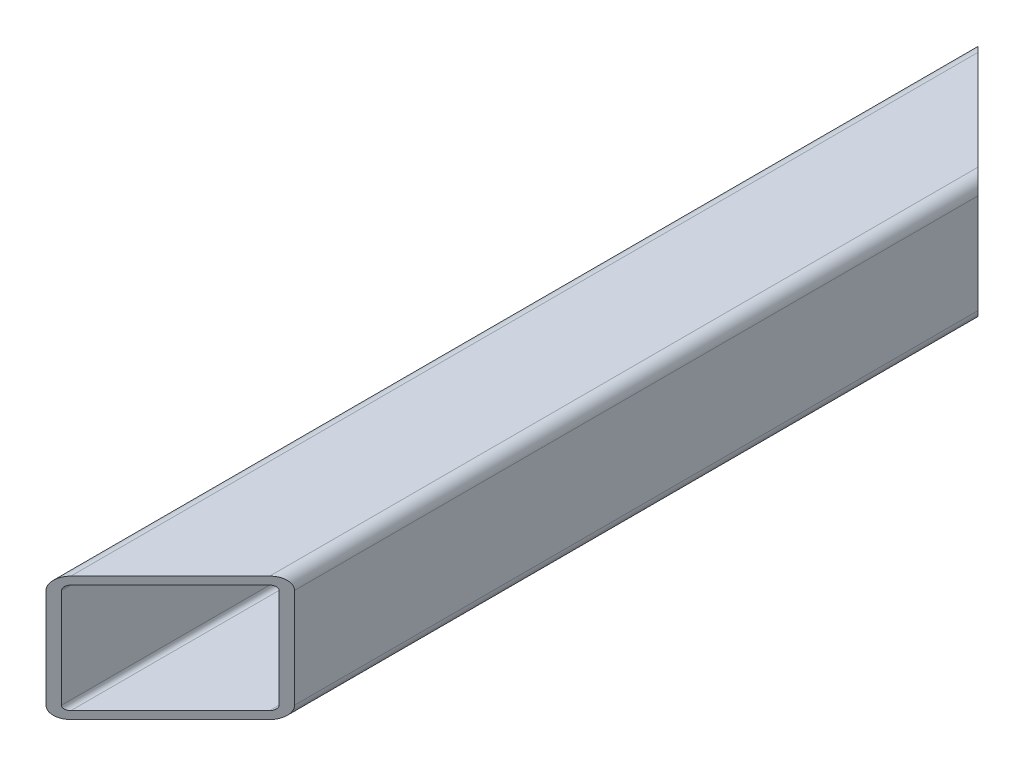
ISO-10303-21;
HEADER;
FILE_DESCRIPTION(('STEP AP214'),'2;1');
FILE_NAME('part.step','',(''),(''),'','','');
FILE_SCHEMA(('AUTOMOTIVE_DESIGN { 1 0 10303 214 1 1 1 1 }'));
ENDSEC;
DATA;
#1=APPLICATION_CONTEXT('core data for automotive mechanical design processes');
#2=APPLICATION_PROTOCOL_DEFINITION('international standard','automotive_design',2000,#1);
#3=PRODUCT_CONTEXT('',#1,'mechanical');
#4=PRODUCT('Part','Part','',(#3));
#5=PRODUCT_RELATED_PRODUCT_CATEGORY('part','',(#4));
#6=PRODUCT_DEFINITION_FORMATION('','',#4);
#7=PRODUCT_DEFINITION_CONTEXT('part definition',#1,'design');
#8=PRODUCT_DEFINITION('design','',#6,#7);
#9=PRODUCT_DEFINITION_SHAPE('','',#8);
#10=(LENGTH_UNIT() NAMED_UNIT(*) SI_UNIT(.MILLI.,.METRE.));
#11=(NAMED_UNIT(*) PLANE_ANGLE_UNIT() SI_UNIT($,.RADIAN.));
#12=(NAMED_UNIT(*) SI_UNIT($,.STERADIAN.) SOLID_ANGLE_UNIT());
#13=UNCERTAINTY_MEASURE_WITH_UNIT(LENGTH_MEASURE(1.E-05),#10,'distance_accuracy_value','');
#14=(GEOMETRIC_REPRESENTATION_CONTEXT(3) GLOBAL_UNCERTAINTY_ASSIGNED_CONTEXT((#13)) GLOBAL_UNIT_ASSIGNED_CONTEXT((#10,
#11,#12)) REPRESENTATION_CONTEXT('',''));
#15=CARTESIAN_POINT('',(0.,0.,0.));
#16=DIRECTION('',(0.,0.,1.));
#17=DIRECTION('',(1.,0.,0.));
#18=AXIS2_PLACEMENT_3D('',#15,#16,#17);
#19=CARTESIAN_POINT('',(72.,8.,-600.));
#20=DIRECTION('',(0.,0.,1.));
#21=DIRECTION('',(1.,0.,0.));
#22=AXIS2_PLACEMENT_3D('',#19,#20,#21);
#23=CYLINDRICAL_SURFACE('',#22,8.);
#24=CARTESIAN_POINT('',(72.,8.,-528.));
#25=DIRECTION('',(-0.707106781186547,0.,0.707106781186548));
#26=DIRECTION('',(0.707106781186548,0.,0.707106781186547));
#27=AXIS2_PLACEMENT_3D('',#24,#25,#26);
#28=ELLIPSE('',#27,11.3137084989848,8.);
#29=CARTESIAN_POINT('',(79.9999999999999,8.,-520.));
#30=VERTEX_POINT('',#29);
#31=CARTESIAN_POINT('',(72.,0.,-528.));
#32=VERTEX_POINT('',#31);
#33=EDGE_CURVE('E246',#30,#32,#28,.F.);
#34=ORIENTED_EDGE('',*,*,#33,.F.);
#35=DIRECTION('',(0.,0.,1.));
#36=VECTOR('',#35,1.);
#37=CARTESIAN_POINT('',(80.,8.,-600.));
#38=LINE('',#37,#36);
#39=CARTESIAN_POINT('',(80.,8.,-80.));
#40=VERTEX_POINT('',#39);
#41=EDGE_CURVE('E156',#30,#40,#38,.T.);
#42=ORIENTED_EDGE('',*,*,#41,.T.);
#43=CARTESIAN_POINT('',(72.,8.,-72.));
#44=DIRECTION('',(-0.707106781186548,0.,-0.707106781186547));
#45=DIRECTION('',(-0.707106781186547,0.,0.707106781186548));
#46=AXIS2_PLACEMENT_3D('',#43,#44,#45);
#47=ELLIPSE('',#46,11.3137084989848,8.);
#48=CARTESIAN_POINT('',(72.,0.,-72.0000000000001));
#49=VERTEX_POINT('',#48);
#50=EDGE_CURVE('E196',#49,#40,#47,.F.);
#51=ORIENTED_EDGE('',*,*,#50,.F.);
#52=DIRECTION('',(0.,0.,1.));
#53=VECTOR('',#52,1.);
#54=CARTESIAN_POINT('',(72.,0.,-600.));
#55=LINE('',#54,#53);
#56=EDGE_CURVE('E182',#32,#49,#55,.T.);
#57=ORIENTED_EDGE('',*,*,#56,.F.);
#58=EDGE_LOOP('',(#34,#42,#51,#57));
#59=FACE_BOUND('',#58,.T.);
#60=ADVANCED_FACE('F33',(#59),#23,.T.);
#61=CARTESIAN_POINT('',(8.,0.,-600.));
#62=DIRECTION('',(0.,-1.,0.));
#63=DIRECTION('',(0.,0.,-1.));
#64=AXIS2_PLACEMENT_3D('',#61,#62,#63);
#65=PLANE('',#64);
#66=DIRECTION('',(0.707106781186548,0.,0.707106781186547));
#67=VECTOR('',#66,1.);
#68=CARTESIAN_POINT('',(79.9999999999999,0.,-520.));
#69=LINE('',#68,#67);
#70=CARTESIAN_POINT('',(8.,0.,-592.));
#71=VERTEX_POINT('',#70);
#72=EDGE_CURVE('E272',#71,#32,#69,.T.);
#73=ORIENTED_EDGE('',*,*,#72,.T.);
#74=ORIENTED_EDGE('',*,*,#56,.T.);
#75=DIRECTION('',(-0.707106781186547,0.,0.707106781186548));
#76=VECTOR('',#75,1.);
#77=CARTESIAN_POINT('',(80.,0.,-80.));
#78=LINE('',#77,#76);
#79=CARTESIAN_POINT('',(7.99999999999998,0.,-8.00000000000001));
#80=VERTEX_POINT('',#79);
#81=EDGE_CURVE('E242',#49,#80,#78,.T.);
#82=ORIENTED_EDGE('',*,*,#81,.T.);
#83=DIRECTION('',(0.,0.,1.));
#84=VECTOR('',#83,1.);
#85=CARTESIAN_POINT('',(8.,0.,-600.));
#86=LINE('',#85,#84);
#87=EDGE_CURVE('E172',#71,#80,#86,.T.);
#88=ORIENTED_EDGE('',*,*,#87,.F.);
#89=EDGE_LOOP('',(#73,#74,#82,#88));
#90=FACE_BOUND('',#89,.T.);
#91=ADVANCED_FACE('F276',(#90),#65,.T.);
#92=CARTESIAN_POINT('',(8.,8.,-600.));
#93=DIRECTION('',(0.,0.,1.));
#94=DIRECTION('',(1.,0.,0.));
#95=AXIS2_PLACEMENT_3D('',#92,#93,#94);
#96=CYLINDRICAL_SURFACE('',#95,8.);
#97=CARTESIAN_POINT('',(8.,8.,-592.));
#98=DIRECTION('',(-0.707106781186547,0.,0.707106781186548));
#99=DIRECTION('',(0.707106781186548,0.,0.707106781186547));
#100=AXIS2_PLACEMENT_3D('',#97,#98,#99);
#101=ELLIPSE('',#100,11.3137084989848,8.);
#102=CARTESIAN_POINT('',(0.,8.,-600.));
#103=VERTEX_POINT('',#102);
#104=EDGE_CURVE('E151',#71,#103,#101,.F.);
#105=ORIENTED_EDGE('',*,*,#104,.F.);
#106=ORIENTED_EDGE('',*,*,#87,.T.);
#107=CARTESIAN_POINT('',(8.,8.,-8.00000000000001));
#108=DIRECTION('',(-0.707106781186548,0.,-0.707106781186547));
#109=DIRECTION('',(-0.707106781186547,0.,0.707106781186548));
#110=AXIS2_PLACEMENT_3D('',#107,#108,#109);
#111=ELLIPSE('',#110,11.3137084989848,8.);
#112=CARTESIAN_POINT('',(0.,8.,0.));
#113=VERTEX_POINT('',#112);
#114=EDGE_CURVE('E211',#113,#80,#111,.F.);
#115=ORIENTED_EDGE('',*,*,#114,.F.);
#116=DIRECTION('',(0.,0.,1.));
#117=VECTOR('',#116,1.);
#118=CARTESIAN_POINT('',(0.,8.,-600.));
#119=LINE('',#118,#117);
#120=EDGE_CURVE('E170',#103,#113,#119,.T.);
#121=ORIENTED_EDGE('',*,*,#120,.F.);
#122=EDGE_LOOP('',(#105,#106,#115,#121));
#123=FACE_BOUND('',#122,.T.);
#124=ADVANCED_FACE('F308',(#123),#96,.T.);
#125=CARTESIAN_POINT('',(0.,8.,-600.));
#126=DIRECTION('',(-1.,0.,0.));
#127=DIRECTION('',(0.,0.,1.));
#128=AXIS2_PLACEMENT_3D('',#125,#126,#127);
#129=PLANE('',#128);
#130=DIRECTION('',(0.,-1.,0.));
#131=VECTOR('',#130,1.);
#132=CARTESIAN_POINT('',(0.,8.,0.));
#133=LINE('',#132,#131);
#134=CARTESIAN_POINT('',(0.,72.,0.));
#135=VERTEX_POINT('',#134);
#136=EDGE_CURVE('E157',#135,#113,#133,.T.);
#137=ORIENTED_EDGE('',*,*,#136,.F.);
#138=DIRECTION('',(0.,0.,1.));
#139=VECTOR('',#138,1.);
#140=CARTESIAN_POINT('',(0.,72.,-600.));
#141=LINE('',#140,#139);
#142=CARTESIAN_POINT('',(0.,72.,-600.));
#143=VERTEX_POINT('',#142);
#144=EDGE_CURVE('E164',#143,#135,#141,.T.);
#145=ORIENTED_EDGE('',*,*,#144,.F.);
#146=DIRECTION('',(0.,-1.,0.));
#147=VECTOR('',#146,1.);
#148=CARTESIAN_POINT('',(0.,8.,-600.));
#149=LINE('',#148,#147);
#150=EDGE_CURVE('E145',#143,#103,#149,.T.);
#151=ORIENTED_EDGE('',*,*,#150,.T.);
#152=ORIENTED_EDGE('',*,*,#120,.T.);
#153=EDGE_LOOP('',(#137,#145,#151,#152));
#154=FACE_BOUND('',#153,.T.);
#155=ADVANCED_FACE('F169',(#154),#129,.T.);
#156=CARTESIAN_POINT('',(7.99999999999999,72.,-600.));
#157=DIRECTION('',(0.,0.,1.));
#158=DIRECTION('',(1.,0.,0.));
#159=AXIS2_PLACEMENT_3D('',#156,#157,#158);
#160=CYLINDRICAL_SURFACE('',#159,8.00000000000001);
#161=CARTESIAN_POINT('',(7.99999999999999,72.,-592.));
#162=DIRECTION('',(-0.707106781186547,0.,0.707106781186548));
#163=DIRECTION('',(0.707106781186548,0.,0.707106781186547));
#164=AXIS2_PLACEMENT_3D('',#161,#162,#163);
#165=ELLIPSE('',#164,11.3137084989848,8.00000000000001);
#166=CARTESIAN_POINT('',(7.99999999999998,80.,-592.));
#167=VERTEX_POINT('',#166);
#168=EDGE_CURVE('E148',#143,#167,#165,.F.);
#169=ORIENTED_EDGE('',*,*,#168,.F.);
#170=ORIENTED_EDGE('',*,*,#144,.T.);
#171=CARTESIAN_POINT('',(7.99999999999999,72.,-8.00000000000001));
#172=DIRECTION('',(-0.707106781186548,0.,-0.707106781186547));
#173=DIRECTION('',(-0.707106781186547,0.,0.707106781186548));
#174=AXIS2_PLACEMENT_3D('',#171,#172,#173);
#175=ELLIPSE('',#174,11.3137084989848,8.00000000000001);
#176=CARTESIAN_POINT('',(7.99999999999995,80.,-7.99999999999997));
#177=VERTEX_POINT('',#176);
#178=EDGE_CURVE('E214',#177,#135,#175,.F.);
#179=ORIENTED_EDGE('',*,*,#178,.F.);
#180=DIRECTION('',(0.,0.,1.));
#181=VECTOR('',#180,1.);
#182=CARTESIAN_POINT('',(7.99999999999999,80.,-600.));
#183=LINE('',#182,#181);
#184=EDGE_CURVE('E166',#167,#177,#183,.T.);
#185=ORIENTED_EDGE('',*,*,#184,.F.);
#186=EDGE_LOOP('',(#169,#170,#179,#185));
#187=FACE_BOUND('',#186,.T.);
#188=ADVANCED_FACE('F162',(#187),#160,.T.);
#189=CARTESIAN_POINT('',(7.99999999999999,80.,-600.));
#190=DIRECTION('',(0.,1.,0.));
#191=DIRECTION('',(-1.,0.,0.));
#192=AXIS2_PLACEMENT_3D('',#189,#190,#191);
#193=PLANE('',#192);
#194=DIRECTION('',(0.707106781186548,0.,0.707106781186547));
#195=VECTOR('',#194,1.);
#196=CARTESIAN_POINT('',(80.,80.,-520.));
#197=LINE('',#196,#195);
#198=CARTESIAN_POINT('',(72.,80.,-528.));
#199=VERTEX_POINT('',#198);
#200=EDGE_CURVE('E273',#167,#199,#197,.T.);
#201=ORIENTED_EDGE('',*,*,#200,.F.);
#202=ORIENTED_EDGE('',*,*,#184,.T.);
#203=DIRECTION('',(-0.707106781186547,0.,0.707106781186548));
#204=VECTOR('',#203,1.);
#205=CARTESIAN_POINT('',(80.,80.,-80.));
#206=LINE('',#205,#204);
#207=CARTESIAN_POINT('',(72.,80.,-72.0000000000001));
#208=VERTEX_POINT('',#207);
#209=EDGE_CURVE('E243',#208,#177,#206,.T.);
#210=ORIENTED_EDGE('',*,*,#209,.F.);
#211=DIRECTION('',(0.,0.,1.));
#212=VECTOR('',#211,1.);
#213=CARTESIAN_POINT('',(72.,80.,-600.));
#214=LINE('',#213,#212);
#215=EDGE_CURVE('E174',#199,#208,#214,.T.);
#216=ORIENTED_EDGE('',*,*,#215,.F.);
#217=EDGE_LOOP('',(#201,#202,#210,#216));
#218=FACE_BOUND('',#217,.T.);
#219=ADVANCED_FACE('F295',(#218),#193,.T.);
#220=CARTESIAN_POINT('',(72.,72.,-600.));
#221=DIRECTION('',(0.,0.,1.));
#222=DIRECTION('',(1.,0.,0.));
#223=AXIS2_PLACEMENT_3D('',#220,#221,#222);
#224=CYLINDRICAL_SURFACE('',#223,7.99999999999999);
#225=CARTESIAN_POINT('',(72.,72.,-528.));
#226=DIRECTION('',(-0.707106781186547,0.,0.707106781186548));
#227=DIRECTION('',(0.707106781186548,0.,0.707106781186547));
#228=AXIS2_PLACEMENT_3D('',#225,#226,#227);
#229=ELLIPSE('',#228,11.3137084989848,7.99999999999999);
#230=CARTESIAN_POINT('',(80.,72.,-520.));
#231=VERTEX_POINT('',#230);
#232=EDGE_CURVE('E167',#199,#231,#229,.F.);
#233=ORIENTED_EDGE('',*,*,#232,.F.);
#234=ORIENTED_EDGE('',*,*,#215,.T.);
#235=CARTESIAN_POINT('',(72.,72.,-72.));
#236=DIRECTION('',(-0.707106781186548,0.,-0.707106781186547));
#237=DIRECTION('',(-0.707106781186547,0.,0.707106781186548));
#238=AXIS2_PLACEMENT_3D('',#235,#236,#237);
#239=ELLIPSE('',#238,11.3137084989848,7.99999999999999);
#240=CARTESIAN_POINT('',(80.,72.,-80.));
#241=VERTEX_POINT('',#240);
#242=EDGE_CURVE('E216',#241,#208,#239,.F.);
#243=ORIENTED_EDGE('',*,*,#242,.F.);
#244=DIRECTION('',(0.,0.,1.));
#245=VECTOR('',#244,1.);
#246=CARTESIAN_POINT('',(80.,72.,-600.));
#247=LINE('',#246,#245);
#248=EDGE_CURVE('E179',#231,#241,#247,.T.);
#249=ORIENTED_EDGE('',*,*,#248,.F.);
#250=EDGE_LOOP('',(#233,#234,#243,#249));
#251=FACE_BOUND('',#250,.T.);
#252=ADVANCED_FACE('F291',(#251),#224,.T.);
#253=CARTESIAN_POINT('',(80.,8.,-600.));
#254=DIRECTION('',(1.,0.,0.));
#255=DIRECTION('',(0.,1.,0.));
#256=AXIS2_PLACEMENT_3D('',#253,#254,#255);
#257=PLANE('',#256);
#258=DIRECTION('',(0.,1.,0.));
#259=VECTOR('',#258,1.);
#260=CARTESIAN_POINT('',(79.9999999999999,0.,-520.));
#261=LINE('',#260,#259);
#262=EDGE_CURVE('E269',#30,#231,#261,.T.);
#263=ORIENTED_EDGE('',*,*,#262,.T.);
#264=ORIENTED_EDGE('',*,*,#248,.T.);
#265=DIRECTION('',(0.,1.,0.));
#266=VECTOR('',#265,1.);
#267=CARTESIAN_POINT('',(80.,0.,-80.));
#268=LINE('',#267,#266);
#269=EDGE_CURVE('E239',#40,#241,#268,.T.);
#270=ORIENTED_EDGE('',*,*,#269,.F.);
#271=ORIENTED_EDGE('',*,*,#41,.F.);
#272=EDGE_LOOP('',(#263,#264,#270,#271));
#273=FACE_BOUND('',#272,.T.);
#274=ADVANCED_FACE('F287',(#273),#257,.T.);
#275=CARTESIAN_POINT('',(7.99999999999999,72.,-600.));
#276=DIRECTION('',(0.,0.,1.));
#277=DIRECTION('',(1.,0.,0.));
#278=AXIS2_PLACEMENT_3D('',#275,#276,#277);
#279=CYLINDRICAL_SURFACE('',#278,3.00000000000001);
#280=DIRECTION('',(0.,0.,1.));
#281=VECTOR('',#280,1.);
#282=CARTESIAN_POINT('',(5.,72.,-600.));
#283=LINE('',#282,#281);
#284=CARTESIAN_POINT('',(5.,72.,-595.));
#285=VERTEX_POINT('',#284);
#286=CARTESIAN_POINT('',(5.,72.,-4.99999999999998));
#287=VERTEX_POINT('',#286);
#288=EDGE_CURVE('E194',#285,#287,#283,.T.);
#289=ORIENTED_EDGE('',*,*,#288,.F.);
#290=CARTESIAN_POINT('',(7.99999999999999,72.,-592.));
#291=DIRECTION('',(-0.707106781186547,0.,0.707106781186548));
#292=DIRECTION('',(0.707106781186548,0.,0.707106781186547));
#293=AXIS2_PLACEMENT_3D('',#290,#291,#292);
#294=ELLIPSE('',#293,4.2426406871193,3.00000000000001);
#295=CARTESIAN_POINT('',(7.99999999999999,75.,-592.));
#296=VERTEX_POINT('',#295);
#297=EDGE_CURVE('E47',#285,#296,#294,.F.);
#298=ORIENTED_EDGE('',*,*,#297,.T.);
#299=DIRECTION('',(0.,0.,1.));
#300=VECTOR('',#299,1.);
#301=CARTESIAN_POINT('',(7.99999999999999,75.,-600.));
#302=LINE('',#301,#300);
#303=CARTESIAN_POINT('',(8.00000000000001,75.,-8.00000000000001));
#304=VERTEX_POINT('',#303);
#305=EDGE_CURVE('E192',#296,#304,#302,.T.);
#306=ORIENTED_EDGE('',*,*,#305,.T.);
#307=CARTESIAN_POINT('',(7.99999999999999,72.,-8.00000000000001));
#308=DIRECTION('',(-0.707106781186548,0.,-0.707106781186547));
#309=DIRECTION('',(-0.707106781186547,0.,0.707106781186548));
#310=AXIS2_PLACEMENT_3D('',#307,#308,#309);
#311=ELLIPSE('',#310,4.2426406871193,3.00000000000001);
#312=EDGE_CURVE('E219',#304,#287,#311,.F.);
#313=ORIENTED_EDGE('',*,*,#312,.T.);
#314=EDGE_LOOP('',(#289,#298,#306,#313));
#315=FACE_BOUND('',#314,.T.);
#316=ADVANCED_FACE('F316',(#315),#279,.F.);
#317=CARTESIAN_POINT('',(7.99999999999999,75.,-600.));
#318=DIRECTION('',(0.,1.,0.));
#319=DIRECTION('',(0.,0.,1.));
#320=AXIS2_PLACEMENT_3D('',#317,#318,#319);
#321=PLANE('',#320);
#322=ORIENTED_EDGE('',*,*,#305,.F.);
#323=DIRECTION('',(0.707106781186548,0.,0.707106781186547));
#324=VECTOR('',#323,1.);
#325=CARTESIAN_POINT('',(4.,75.,-596.));
#326=LINE('',#325,#324);
#327=CARTESIAN_POINT('',(72.,75.,-528.));
#328=VERTEX_POINT('',#327);
#329=EDGE_CURVE('E252',#296,#328,#326,.T.);
#330=ORIENTED_EDGE('',*,*,#329,.T.);
#331=DIRECTION('',(0.,0.,1.));
#332=VECTOR('',#331,1.);
#333=CARTESIAN_POINT('',(72.,75.,-600.));
#334=LINE('',#333,#332);
#335=CARTESIAN_POINT('',(72.,75.,-72.));
#336=VERTEX_POINT('',#335);
#337=EDGE_CURVE('E206',#328,#336,#334,.T.);
#338=ORIENTED_EDGE('',*,*,#337,.T.);
#339=DIRECTION('',(-0.707106781186547,0.,0.707106781186548));
#340=VECTOR('',#339,1.);
#341=CARTESIAN_POINT('',(304.,75.,-304.));
#342=LINE('',#341,#340);
#343=EDGE_CURVE('E222',#336,#304,#342,.T.);
#344=ORIENTED_EDGE('',*,*,#343,.T.);
#345=EDGE_LOOP('',(#322,#330,#338,#344));
#346=FACE_BOUND('',#345,.T.);
#347=ADVANCED_FACE('F354',(#346),#321,.F.);
#348=CARTESIAN_POINT('',(72.,72.,-600.));
#349=DIRECTION('',(0.,0.,1.));
#350=DIRECTION('',(1.,0.,0.));
#351=AXIS2_PLACEMENT_3D('',#348,#349,#350);
#352=CYLINDRICAL_SURFACE('',#351,3.00000000000002);
#353=ORIENTED_EDGE('',*,*,#337,.F.);
#354=CARTESIAN_POINT('',(72.,72.,-528.));
#355=DIRECTION('',(-0.707106781186547,0.,0.707106781186548));
#356=DIRECTION('',(0.707106781186548,0.,0.707106781186547));
#357=AXIS2_PLACEMENT_3D('',#354,#355,#356);
#358=ELLIPSE('',#357,4.24264068711931,3.00000000000002);
#359=CARTESIAN_POINT('',(75.,72.,-525.));
#360=VERTEX_POINT('',#359);
#361=EDGE_CURVE('E255',#328,#360,#358,.F.);
#362=ORIENTED_EDGE('',*,*,#361,.T.);
#363=DIRECTION('',(0.,0.,1.));
#364=VECTOR('',#363,1.);
#365=CARTESIAN_POINT('',(75.,72.,-600.));
#366=LINE('',#365,#364);
#367=CARTESIAN_POINT('',(75.,72.,-75.));
#368=VERTEX_POINT('',#367);
#369=EDGE_CURVE('E204',#360,#368,#366,.T.);
#370=ORIENTED_EDGE('',*,*,#369,.T.);
#371=CARTESIAN_POINT('',(72.,72.,-72.));
#372=DIRECTION('',(-0.707106781186548,0.,-0.707106781186547));
#373=DIRECTION('',(-0.707106781186547,0.,0.707106781186548));
#374=AXIS2_PLACEMENT_3D('',#371,#372,#373);
#375=ELLIPSE('',#374,4.24264068711931,3.00000000000002);
#376=EDGE_CURVE('E225',#368,#336,#375,.F.);
#377=ORIENTED_EDGE('',*,*,#376,.T.);
#378=EDGE_LOOP('',(#353,#362,#370,#377));
#379=FACE_BOUND('',#378,.T.);
#380=ADVANCED_FACE('F363',(#379),#352,.F.);
#381=CARTESIAN_POINT('',(75.,8.,-600.));
#382=DIRECTION('',(1.,0.,0.));
#383=DIRECTION('',(0.,0.,-1.));
#384=AXIS2_PLACEMENT_3D('',#381,#382,#383);
#385=PLANE('',#384);
#386=ORIENTED_EDGE('',*,*,#369,.F.);
#387=DIRECTION('',(0.,-1.,0.));
#388=VECTOR('',#387,1.);
#389=CARTESIAN_POINT('',(75.,8.00000000000004,-525.));
#390=LINE('',#389,#388);
#391=CARTESIAN_POINT('',(75.,8.,-525.));
#392=VERTEX_POINT('',#391);
#393=EDGE_CURVE('E258',#360,#392,#390,.T.);
#394=ORIENTED_EDGE('',*,*,#393,.T.);
#395=DIRECTION('',(0.,0.,1.));
#396=VECTOR('',#395,1.);
#397=CARTESIAN_POINT('',(75.,8.,-600.));
#398=LINE('',#397,#396);
#399=CARTESIAN_POINT('',(75.,8.,-74.9999999999998));
#400=VERTEX_POINT('',#399);
#401=EDGE_CURVE('E202',#392,#400,#398,.T.);
#402=ORIENTED_EDGE('',*,*,#401,.T.);
#403=DIRECTION('',(0.,1.,0.));
#404=VECTOR('',#403,1.);
#405=CARTESIAN_POINT('',(75.,7.99999999999977,-75.0000000000001));
#406=LINE('',#405,#404);
#407=EDGE_CURVE('E228',#400,#368,#406,.T.);
#408=ORIENTED_EDGE('',*,*,#407,.T.);
#409=EDGE_LOOP('',(#386,#394,#402,#408));
#410=FACE_BOUND('',#409,.T.);
#411=ADVANCED_FACE('F373',(#410),#385,.F.);
#412=CARTESIAN_POINT('',(72.,8.,-600.));
#413=DIRECTION('',(0.,0.,1.));
#414=DIRECTION('',(1.,0.,0.));
#415=AXIS2_PLACEMENT_3D('',#412,#413,#414);
#416=CYLINDRICAL_SURFACE('',#415,2.99999999999999);
#417=ORIENTED_EDGE('',*,*,#401,.F.);
#418=CARTESIAN_POINT('',(72.,8.,-528.));
#419=DIRECTION('',(-0.707106781186547,0.,0.707106781186548));
#420=DIRECTION('',(0.707106781186548,0.,0.707106781186547));
#421=AXIS2_PLACEMENT_3D('',#418,#419,#420);
#422=ELLIPSE('',#421,4.24264068711927,2.99999999999999);
#423=CARTESIAN_POINT('',(72.,5.,-528.));
#424=VERTEX_POINT('',#423);
#425=EDGE_CURVE('E261',#392,#424,#422,.F.);
#426=ORIENTED_EDGE('',*,*,#425,.T.);
#427=DIRECTION('',(0.,0.,1.));
#428=VECTOR('',#427,1.);
#429=CARTESIAN_POINT('',(72.,5.00000000000001,-600.));
#430=LINE('',#429,#428);
#431=CARTESIAN_POINT('',(72.,5.,-72.));
#432=VERTEX_POINT('',#431);
#433=EDGE_CURVE('E200',#424,#432,#430,.T.);
#434=ORIENTED_EDGE('',*,*,#433,.T.);
#435=CARTESIAN_POINT('',(72.,8.,-72.));
#436=DIRECTION('',(-0.707106781186548,0.,-0.707106781186547));
#437=DIRECTION('',(-0.707106781186547,0.,0.707106781186548));
#438=AXIS2_PLACEMENT_3D('',#435,#436,#437);
#439=ELLIPSE('',#438,4.24264068711928,2.99999999999999);
#440=EDGE_CURVE('E231',#432,#400,#439,.F.);
#441=ORIENTED_EDGE('',*,*,#440,.T.);
#442=EDGE_LOOP('',(#417,#426,#434,#441));
#443=FACE_BOUND('',#442,.T.);
#444=ADVANCED_FACE('F383',(#443),#416,.F.);
#445=CARTESIAN_POINT('',(8.,5.,-600.));
#446=DIRECTION('',(0.,-1.,0.));
#447=DIRECTION('',(1.,0.,0.));
#448=AXIS2_PLACEMENT_3D('',#445,#446,#447);
#449=PLANE('',#448);
#450=ORIENTED_EDGE('',*,*,#433,.F.);
#451=DIRECTION('',(-0.707106781186548,0.,-0.707106781186547));
#452=VECTOR('',#451,1.);
#453=CARTESIAN_POINT('',(3.99999999999998,5.,-596.));
#454=LINE('',#453,#452);
#455=CARTESIAN_POINT('',(8.,5.,-592.));
#456=VERTEX_POINT('',#455);
#457=EDGE_CURVE('E264',#424,#456,#454,.T.);
#458=ORIENTED_EDGE('',*,*,#457,.T.);
#459=DIRECTION('',(0.,0.,1.));
#460=VECTOR('',#459,1.);
#461=CARTESIAN_POINT('',(8.,5.,-600.));
#462=LINE('',#461,#460);
#463=CARTESIAN_POINT('',(8.,5.,-8.00000000000001));
#464=VERTEX_POINT('',#463);
#465=EDGE_CURVE('E198',#456,#464,#462,.T.);
#466=ORIENTED_EDGE('',*,*,#465,.T.);
#467=DIRECTION('',(0.707106781186547,0.,-0.707106781186548));
#468=VECTOR('',#467,1.);
#469=CARTESIAN_POINT('',(304.,5.00000000000002,-304.));
#470=LINE('',#469,#468);
#471=EDGE_CURVE('E234',#464,#432,#470,.T.);
#472=ORIENTED_EDGE('',*,*,#471,.T.);
#473=EDGE_LOOP('',(#450,#458,#466,#472));
#474=FACE_BOUND('',#473,.T.);
#475=ADVANCED_FACE('F393',(#474),#449,.F.);
#476=CARTESIAN_POINT('',(8.,8.,-600.));
#477=DIRECTION('',(0.,0.,1.));
#478=DIRECTION('',(1.,0.,0.));
#479=AXIS2_PLACEMENT_3D('',#476,#477,#478);
#480=CYLINDRICAL_SURFACE('',#479,3.);
#481=ORIENTED_EDGE('',*,*,#465,.F.);
#482=CARTESIAN_POINT('',(8.,8.,-592.));
#483=DIRECTION('',(-0.707106781186547,0.,0.707106781186548));
#484=DIRECTION('',(0.707106781186548,0.,0.707106781186547));
#485=AXIS2_PLACEMENT_3D('',#482,#483,#484);
#486=ELLIPSE('',#485,4.24264068711928,3.);
#487=CARTESIAN_POINT('',(5.,8.,-595.));
#488=VERTEX_POINT('',#487);
#489=EDGE_CURVE('E267',#456,#488,#486,.F.);
#490=ORIENTED_EDGE('',*,*,#489,.T.);
#491=DIRECTION('',(0.,0.,1.));
#492=VECTOR('',#491,1.);
#493=CARTESIAN_POINT('',(5.,8.,-600.));
#494=LINE('',#493,#492);
#495=CARTESIAN_POINT('',(5.,8.,-5.));
#496=VERTEX_POINT('',#495);
#497=EDGE_CURVE('E54',#488,#496,#494,.T.);
#498=ORIENTED_EDGE('',*,*,#497,.T.);
#499=CARTESIAN_POINT('',(8.,8.,-8.00000000000001));
#500=DIRECTION('',(-0.707106781186548,0.,-0.707106781186547));
#501=DIRECTION('',(-0.707106781186547,0.,0.707106781186548));
#502=AXIS2_PLACEMENT_3D('',#499,#500,#501);
#503=ELLIPSE('',#502,4.24264068711929,3.);
#504=EDGE_CURVE('E237',#496,#464,#503,.F.);
#505=ORIENTED_EDGE('',*,*,#504,.T.);
#506=EDGE_LOOP('',(#481,#490,#498,#505));
#507=FACE_BOUND('',#506,.T.);
#508=ADVANCED_FACE('F403',(#507),#480,.F.);
#509=CARTESIAN_POINT('',(5.,8.,-600.));
#510=DIRECTION('',(-1.,0.,0.));
#511=DIRECTION('',(0.,0.,1.));
#512=AXIS2_PLACEMENT_3D('',#509,#510,#511);
#513=PLANE('',#512);
#514=ORIENTED_EDGE('',*,*,#497,.F.);
#515=DIRECTION('',(0.,1.,0.));
#516=VECTOR('',#515,1.);
#517=CARTESIAN_POINT('',(5.,8.,-595.));
#518=LINE('',#517,#516);
#519=EDGE_CURVE('E11',#488,#285,#518,.T.);
#520=ORIENTED_EDGE('',*,*,#519,.T.);
#521=ORIENTED_EDGE('',*,*,#288,.T.);
#522=DIRECTION('',(0.,-1.,0.));
#523=VECTOR('',#522,1.);
#524=CARTESIAN_POINT('',(5.,7.99999999999974,-5.));
#525=LINE('',#524,#523);
#526=EDGE_CURVE('E40',#287,#496,#525,.T.);
#527=ORIENTED_EDGE('',*,*,#526,.T.);
#528=EDGE_LOOP('',(#514,#520,#521,#527));
#529=FACE_BOUND('',#528,.T.);
#530=ADVANCED_FACE('F413',(#529),#513,.F.);
#531=CARTESIAN_POINT('',(80.,0.,-80.));
#532=DIRECTION('',(-0.707106781186548,0.,-0.707106781186547));
#533=DIRECTION('',(-0.707106781186547,0.,0.707106781186548));
#534=AXIS2_PLACEMENT_3D('',#531,#532,#533);
#535=PLANE('',#534);
#536=ORIENTED_EDGE('',*,*,#50,.T.);
#537=ORIENTED_EDGE('',*,*,#269,.T.);
#538=ORIENTED_EDGE('',*,*,#242,.T.);
#539=ORIENTED_EDGE('',*,*,#209,.T.);
#540=ORIENTED_EDGE('',*,*,#178,.T.);
#541=ORIENTED_EDGE('',*,*,#136,.T.);
#542=ORIENTED_EDGE('',*,*,#114,.T.);
#543=ORIENTED_EDGE('',*,*,#81,.F.);
#544=EDGE_LOOP('',(#536,#537,#538,#539,#540,#541,#542,#543));
#545=FACE_BOUND('',#544,.T.);
#546=ORIENTED_EDGE('',*,*,#343,.F.);
#547=ORIENTED_EDGE('',*,*,#376,.F.);
#548=ORIENTED_EDGE('',*,*,#407,.F.);
#549=ORIENTED_EDGE('',*,*,#440,.F.);
#550=ORIENTED_EDGE('',*,*,#471,.F.);
#551=ORIENTED_EDGE('',*,*,#504,.F.);
#552=ORIENTED_EDGE('',*,*,#526,.F.);
#553=ORIENTED_EDGE('',*,*,#312,.F.);
#554=EDGE_LOOP('',(#546,#547,#548,#549,#550,#551,#552,#553));
#555=FACE_BOUND('',#554,.T.);
#556=ADVANCED_FACE('F283',(#545,#555),#535,.F.);
#557=CARTESIAN_POINT('',(79.9999999999999,0.,-520.));
#558=DIRECTION('',(-0.707106781186547,0.,0.707106781186548));
#559=DIRECTION('',(0.707106781186548,0.,0.707106781186547));
#560=AXIS2_PLACEMENT_3D('',#557,#558,#559);
#561=PLANE('',#560);
#562=ORIENTED_EDGE('',*,*,#33,.T.);
#563=ORIENTED_EDGE('',*,*,#72,.F.);
#564=ORIENTED_EDGE('',*,*,#104,.T.);
#565=ORIENTED_EDGE('',*,*,#150,.F.);
#566=ORIENTED_EDGE('',*,*,#168,.T.);
#567=ORIENTED_EDGE('',*,*,#200,.T.);
#568=ORIENTED_EDGE('',*,*,#232,.T.);
#569=ORIENTED_EDGE('',*,*,#262,.F.);
#570=EDGE_LOOP('',(#562,#563,#564,#565,#566,#567,#568,#569));
#571=FACE_BOUND('',#570,.T.);
#572=ORIENTED_EDGE('',*,*,#519,.F.);
#573=ORIENTED_EDGE('',*,*,#489,.F.);
#574=ORIENTED_EDGE('',*,*,#457,.F.);
#575=ORIENTED_EDGE('',*,*,#425,.F.);
#576=ORIENTED_EDGE('',*,*,#393,.F.);
#577=ORIENTED_EDGE('',*,*,#361,.F.);
#578=ORIENTED_EDGE('',*,*,#329,.F.);
#579=ORIENTED_EDGE('',*,*,#297,.F.);
#580=EDGE_LOOP('',(#572,#573,#574,#575,#576,#577,#578,#579));
#581=FACE_BOUND('',#580,.T.);
#582=ADVANCED_FACE('F147',(#571,#581),#561,.F.);
#583=CLOSED_SHELL('',(#60,#91,#124,#155,#188,#219,#252,#274,#316,#347,#380,#411,#444,#475,#508,
#530,#556,#582));
#584=MANIFOLD_SOLID_BREP('B2',#583);
#585=ADVANCED_BREP_SHAPE_REPRESENTATION('',(#18,#584),#14);
#586=SHAPE_DEFINITION_REPRESENTATION(#9,#585);
ENDSEC;
END-ISO-10303-21;
